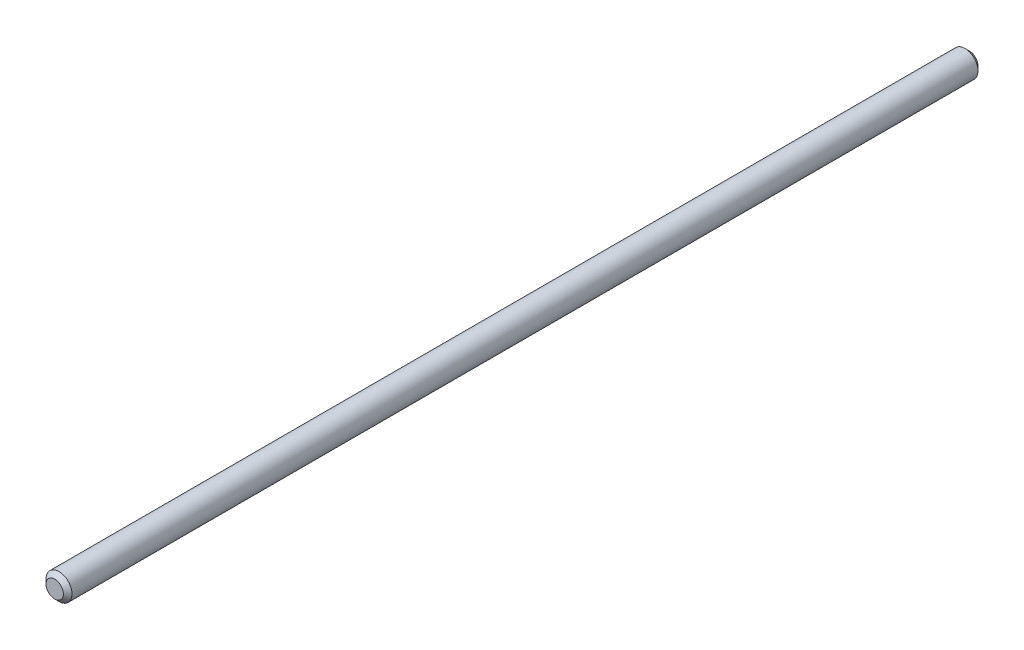
ISO-10303-21;
HEADER;
FILE_DESCRIPTION(('STEP AP214'),'2;1');
FILE_NAME('part.step','',(''),(''),'','','');
FILE_SCHEMA(('AUTOMOTIVE_DESIGN { 1 0 10303 214 1 1 1 1 }'));
ENDSEC;
DATA;
#1=APPLICATION_CONTEXT('core data for automotive mechanical design processes');
#2=APPLICATION_PROTOCOL_DEFINITION('international standard','automotive_design',2000,#1);
#3=PRODUCT_CONTEXT('',#1,'mechanical');
#4=PRODUCT('Part','Part','',(#3));
#5=PRODUCT_RELATED_PRODUCT_CATEGORY('part','',(#4));
#6=PRODUCT_DEFINITION_FORMATION('','',#4);
#7=PRODUCT_DEFINITION_CONTEXT('part definition',#1,'design');
#8=PRODUCT_DEFINITION('design','',#6,#7);
#9=PRODUCT_DEFINITION_SHAPE('','',#8);
#10=(LENGTH_UNIT() NAMED_UNIT(*) SI_UNIT(.MILLI.,.METRE.));
#11=(NAMED_UNIT(*) PLANE_ANGLE_UNIT() SI_UNIT($,.RADIAN.));
#12=(NAMED_UNIT(*) SI_UNIT($,.STERADIAN.) SOLID_ANGLE_UNIT());
#13=UNCERTAINTY_MEASURE_WITH_UNIT(LENGTH_MEASURE(1.E-05),#10,'distance_accuracy_value','');
#14=(GEOMETRIC_REPRESENTATION_CONTEXT(3) GLOBAL_UNCERTAINTY_ASSIGNED_CONTEXT((#13)) GLOBAL_UNIT_ASSIGNED_CONTEXT((#10,
#11,#12)) REPRESENTATION_CONTEXT('',''));
#15=CARTESIAN_POINT('',(0.,0.,0.));
#16=DIRECTION('',(0.,0.,1.));
#17=DIRECTION('',(1.,0.,0.));
#18=AXIS2_PLACEMENT_3D('',#15,#16,#17);
#19=CARTESIAN_POINT('',(0.,0.,52.75559792));
#20=DIRECTION('',(0.,0.,-1.));
#21=DIRECTION('',(-1.,0.,0.));
#22=AXIS2_PLACEMENT_3D('',#19,#20,#21);
#23=CYLINDRICAL_SURFACE('',#22,1.5);
#24=CARTESIAN_POINT('',(0.,0.,-52.25559792));
#25=DIRECTION('',(0.,0.,1.));
#26=DIRECTION('',(1.,0.,0.));
#27=AXIS2_PLACEMENT_3D('',#24,#25,#26);
#28=CIRCLE('',#27,1.5);
#29=CARTESIAN_POINT('',(1.5,0.,-52.25559792));
#30=VERTEX_POINT('',#29);
#31=EDGE_CURVE('E43',#30,#30,#28,.T.);
#32=ORIENTED_EDGE('',*,*,#31,.T.);
#33=EDGE_LOOP('',(#32));
#34=FACE_BOUND('',#33,.T.);
#35=CARTESIAN_POINT('',(0.,0.,52.25559792));
#36=DIRECTION('',(0.,0.,1.));
#37=DIRECTION('',(1.,0.,0.));
#38=AXIS2_PLACEMENT_3D('',#35,#36,#37);
#39=CIRCLE('',#38,1.5);
#40=CARTESIAN_POINT('',(1.5,0.,52.25559792));
#41=VERTEX_POINT('',#40);
#42=EDGE_CURVE('E47',#41,#41,#39,.F.);
#43=ORIENTED_EDGE('',*,*,#42,.T.);
#44=EDGE_LOOP('',(#43));
#45=FACE_BOUND('',#44,.T.);
#46=ADVANCED_FACE('F32',(#34,#45),#23,.T.);
#47=CARTESIAN_POINT('',(0.,0.,52.75559792));
#48=DIRECTION('',(0.,0.,1.));
#49=DIRECTION('',(1.,0.,0.));
#50=AXIS2_PLACEMENT_3D('',#47,#48,#49);
#51=PLANE('',#50);
#52=CARTESIAN_POINT('',(0.,0.,52.75559792));
#53=DIRECTION('',(0.,0.,1.));
#54=DIRECTION('',(1.,0.,0.));
#55=AXIS2_PLACEMENT_3D('',#52,#53,#54);
#56=CIRCLE('',#55,1.);
#57=CARTESIAN_POINT('',(1.,0.,52.75559792));
#58=VERTEX_POINT('',#57);
#59=EDGE_CURVE('E10',#58,#58,#56,.T.);
#60=ORIENTED_EDGE('',*,*,#59,.T.);
#61=EDGE_LOOP('',(#60));
#62=FACE_BOUND('',#61,.T.);
#63=ADVANCED_FACE('F63',(#62),#51,.T.);
#64=CARTESIAN_POINT('',(0.,0.,-52.75559792));
#65=DIRECTION('',(0.,0.,1.));
#66=DIRECTION('',(1.,0.,0.));
#67=AXIS2_PLACEMENT_3D('',#64,#65,#66);
#68=PLANE('',#67);
#69=CARTESIAN_POINT('',(0.,0.,-52.75559792));
#70=DIRECTION('',(0.,0.,1.));
#71=DIRECTION('',(1.,0.,0.));
#72=AXIS2_PLACEMENT_3D('',#69,#70,#71);
#73=CIRCLE('',#72,0.999999999999998);
#74=CARTESIAN_POINT('',(0.999999999999998,0.,-52.75559792));
#75=VERTEX_POINT('',#74);
#76=EDGE_CURVE('E39',#75,#75,#73,.F.);
#77=ORIENTED_EDGE('',*,*,#76,.T.);
#78=EDGE_LOOP('',(#77));
#79=FACE_BOUND('',#78,.T.);
#80=ADVANCED_FACE('F60',(#79),#68,.F.);
#81=CARTESIAN_POINT('',(0.,0.,-52.25559792));
#82=DIRECTION('',(0.,0.,1.));
#83=DIRECTION('',(1.,0.,0.));
#84=AXIS2_PLACEMENT_3D('',#81,#82,#83);
#85=CONICAL_SURFACE('',#84,1.5,0.785398163397437);
#86=ORIENTED_EDGE('',*,*,#76,.F.);
#87=EDGE_LOOP('',(#86));
#88=FACE_BOUND('',#87,.T.);
#89=ORIENTED_EDGE('',*,*,#31,.F.);
#90=EDGE_LOOP('',(#89));
#91=FACE_BOUND('',#90,.T.);
#92=ADVANCED_FACE('F56',(#88,#91),#85,.T.);
#93=CARTESIAN_POINT('',(0.,0.,52.75559792));
#94=DIRECTION('',(0.,0.,-1.));
#95=DIRECTION('',(-1.,0.,0.));
#96=AXIS2_PLACEMENT_3D('',#93,#94,#95);
#97=CONICAL_SURFACE('',#96,1.,0.785398163397441);
#98=ORIENTED_EDGE('',*,*,#42,.F.);
#99=EDGE_LOOP('',(#98));
#100=FACE_BOUND('',#99,.T.);
#101=ORIENTED_EDGE('',*,*,#59,.F.);
#102=EDGE_LOOP('',(#101));
#103=FACE_BOUND('',#102,.T.);
#104=ADVANCED_FACE('F34',(#100,#103),#97,.T.);
#105=CLOSED_SHELL('',(#46,#63,#80,#92,#104));
#106=MANIFOLD_SOLID_BREP('B2',#105);
#107=ADVANCED_BREP_SHAPE_REPRESENTATION('',(#18,#106),#14);
#108=SHAPE_DEFINITION_REPRESENTATION(#9,#107);
ENDSEC;
END-ISO-10303-21;
